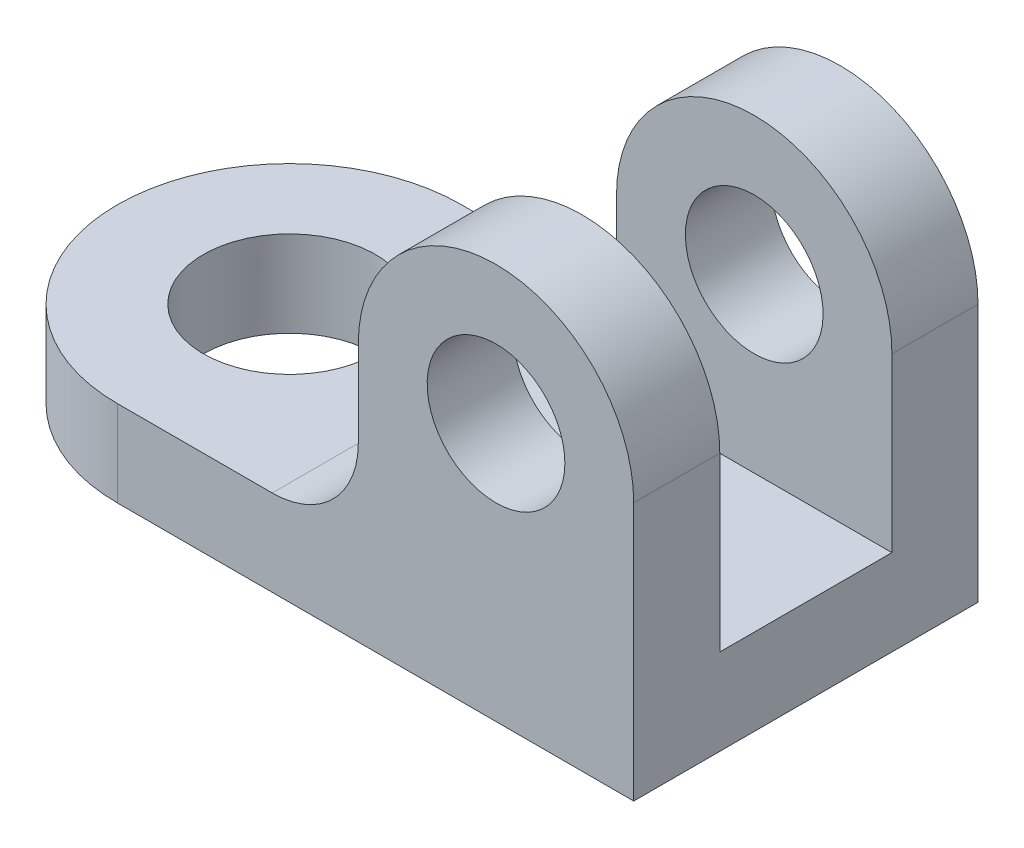
ISO-10303-21;
HEADER;
FILE_DESCRIPTION(('STEP AP214'),'2;1');
FILE_NAME('part.step','',(''),(''),'','','');
FILE_SCHEMA(('AUTOMOTIVE_DESIGN { 1 0 10303 214 1 1 1 1 }'));
ENDSEC;
DATA;
#1=APPLICATION_CONTEXT('core data for automotive mechanical design processes');
#2=APPLICATION_PROTOCOL_DEFINITION('international standard','automotive_design',2000,#1);
#3=PRODUCT_CONTEXT('',#1,'mechanical');
#4=PRODUCT('Part','Part','',(#3));
#5=PRODUCT_RELATED_PRODUCT_CATEGORY('part','',(#4));
#6=PRODUCT_DEFINITION_FORMATION('','',#4);
#7=PRODUCT_DEFINITION_CONTEXT('part definition',#1,'design');
#8=PRODUCT_DEFINITION('design','',#6,#7);
#9=PRODUCT_DEFINITION_SHAPE('','',#8);
#10=(LENGTH_UNIT() NAMED_UNIT(*) SI_UNIT(.MILLI.,.METRE.));
#11=(NAMED_UNIT(*) PLANE_ANGLE_UNIT() SI_UNIT($,.RADIAN.));
#12=(NAMED_UNIT(*) SI_UNIT($,.STERADIAN.) SOLID_ANGLE_UNIT());
#13=UNCERTAINTY_MEASURE_WITH_UNIT(LENGTH_MEASURE(1.E-05),#10,'distance_accuracy_value','');
#14=(GEOMETRIC_REPRESENTATION_CONTEXT(3) GLOBAL_UNCERTAINTY_ASSIGNED_CONTEXT((#13)) GLOBAL_UNIT_ASSIGNED_CONTEXT((#10,
#11,#12)) REPRESENTATION_CONTEXT('',''));
#15=CARTESIAN_POINT('',(0.,0.,0.));
#16=DIRECTION('',(0.,0.,1.));
#17=DIRECTION('',(1.,0.,0.));
#18=AXIS2_PLACEMENT_3D('',#15,#16,#17);
#19=CARTESIAN_POINT('',(-8.,0.,10.));
#20=DIRECTION('',(1.,0.,0.));
#21=DIRECTION('',(0.,0.,-1.));
#22=AXIS2_PLACEMENT_3D('',#19,#20,#21);
#23=PLANE('',#22);
#24=DIRECTION('',(0.,0.,-1.));
#25=VECTOR('',#24,1.);
#26=CARTESIAN_POINT('',(-8.,0.,10.));
#27=LINE('',#26,#25);
#28=CARTESIAN_POINT('',(-8.,0.,10.));
#29=VERTEX_POINT('',#28);
#30=CARTESIAN_POINT('',(-8.,0.,5.));
#31=VERTEX_POINT('',#30);
#32=EDGE_CURVE('E153',#29,#31,#27,.T.);
#33=ORIENTED_EDGE('',*,*,#32,.T.);
#34=DIRECTION('',(0.,-1.,0.));
#35=VECTOR('',#34,1.);
#36=CARTESIAN_POINT('',(-8.,0.,5.));
#37=LINE('',#36,#35);
#38=CARTESIAN_POINT('',(-8.,-5.,5.));
#39=VERTEX_POINT('',#38);
#40=EDGE_CURVE('E204',#31,#39,#37,.T.);
#41=ORIENTED_EDGE('',*,*,#40,.T.);
#42=DIRECTION('',(0.,0.,-1.));
#43=VECTOR('',#42,1.);
#44=CARTESIAN_POINT('',(-8.,-5.,10.));
#45=LINE('',#44,#43);
#46=CARTESIAN_POINT('',(-8.,-5.,10.));
#47=VERTEX_POINT('',#46);
#48=EDGE_CURVE('E267',#47,#39,#45,.T.);
#49=ORIENTED_EDGE('',*,*,#48,.F.);
#50=DIRECTION('',(0.,-1.,0.));
#51=VECTOR('',#50,1.);
#52=CARTESIAN_POINT('',(-8.,0.,10.));
#53=LINE('',#52,#51);
#54=EDGE_CURVE('E224',#29,#47,#53,.T.);
#55=ORIENTED_EDGE('',*,*,#54,.F.);
#56=EDGE_LOOP('',(#33,#41,#49,#55));
#57=FACE_BOUND('',#56,.T.);
#58=ADVANCED_FACE('F45',(#57),#23,.F.);
#59=CARTESIAN_POINT('',(0.,0.,10.));
#60=DIRECTION('',(0.,0.,-1.));
#61=DIRECTION('',(-1.,0.,0.));
#62=AXIS2_PLACEMENT_3D('',#59,#60,#61);
#63=CYLINDRICAL_SURFACE('',#62,8.);
#64=DIRECTION('',(0.,0.,-1.));
#65=VECTOR('',#64,1.);
#66=CARTESIAN_POINT('',(8.,0.,10.));
#67=LINE('',#66,#65);
#68=CARTESIAN_POINT('',(8.,0.,10.));
#69=VERTEX_POINT('',#68);
#70=CARTESIAN_POINT('',(8.,0.,5.));
#71=VERTEX_POINT('',#70);
#72=EDGE_CURVE('E254',#69,#71,#67,.T.);
#73=ORIENTED_EDGE('',*,*,#72,.T.);
#74=CARTESIAN_POINT('',(0.,0.,5.));
#75=DIRECTION('',(0.,0.,1.));
#76=DIRECTION('',(0.,-1.,0.));
#77=AXIS2_PLACEMENT_3D('',#74,#75,#76);
#78=CIRCLE('',#77,8.);
#79=EDGE_CURVE('E208',#71,#31,#78,.T.);
#80=ORIENTED_EDGE('',*,*,#79,.T.);
#81=ORIENTED_EDGE('',*,*,#32,.F.);
#82=CARTESIAN_POINT('',(0.,0.,10.));
#83=DIRECTION('',(0.,0.,1.));
#84=DIRECTION('',(-1.,0.,0.));
#85=AXIS2_PLACEMENT_3D('',#82,#83,#84);
#86=CIRCLE('',#85,8.);
#87=EDGE_CURVE('E220',#69,#29,#86,.T.);
#88=ORIENTED_EDGE('',*,*,#87,.F.);
#89=EDGE_LOOP('',(#73,#80,#81,#88));
#90=FACE_BOUND('',#89,.T.);
#91=ADVANCED_FACE('F288',(#90),#63,.T.);
#92=CARTESIAN_POINT('',(0.,0.,10.));
#93=DIRECTION('',(0.,0.,-1.));
#94=DIRECTION('',(-1.,0.,0.));
#95=AXIS2_PLACEMENT_3D('',#92,#93,#94);
#96=CYLINDRICAL_SURFACE('',#95,4.);
#97=CARTESIAN_POINT('',(0.,0.,5.));
#98=DIRECTION('',(0.,0.,1.));
#99=DIRECTION('',(0.,-1.,0.));
#100=AXIS2_PLACEMENT_3D('',#97,#98,#99);
#101=CIRCLE('',#100,4.);
#102=CARTESIAN_POINT('',(0.,-4.,5.));
#103=VERTEX_POINT('',#102);
#104=EDGE_CURVE('E199',#103,#103,#101,.T.);
#105=ORIENTED_EDGE('',*,*,#104,.F.);
#106=EDGE_LOOP('',(#105));
#107=FACE_BOUND('',#106,.T.);
#108=CARTESIAN_POINT('',(0.,0.,10.));
#109=DIRECTION('',(0.,0.,1.));
#110=DIRECTION('',(1.,0.,0.));
#111=AXIS2_PLACEMENT_3D('',#108,#109,#110);
#112=CIRCLE('',#111,4.);
#113=CARTESIAN_POINT('',(4.,0.,10.));
#114=VERTEX_POINT('',#113);
#115=EDGE_CURVE('E212',#114,#114,#112,.T.);
#116=ORIENTED_EDGE('',*,*,#115,.T.);
#117=EDGE_LOOP('',(#116));
#118=FACE_BOUND('',#117,.T.);
#119=ADVANCED_FACE('F285',(#107,#118),#96,.F.);
#120=CARTESIAN_POINT('',(0.,0.,-5.));
#121=DIRECTION('',(0.,0.,-1.));
#122=DIRECTION('',(0.,1.,0.));
#123=AXIS2_PLACEMENT_3D('',#120,#121,#122);
#124=CIRCLE('',#123,8.);
#125=CARTESIAN_POINT('',(-8.,0.,-5.));
#126=VERTEX_POINT('',#125);
#127=CARTESIAN_POINT('',(8.,0.,-5.));
#128=VERTEX_POINT('',#127);
#129=EDGE_CURVE('E196',#126,#128,#124,.T.);
#130=ORIENTED_EDGE('',*,*,#129,.T.);
#131=CARTESIAN_POINT('',(8.,0.,-10.));
#132=VERTEX_POINT('',#131);
#133=EDGE_CURVE('E239',#128,#132,#67,.T.);
#134=ORIENTED_EDGE('',*,*,#133,.T.);
#135=CARTESIAN_POINT('',(0.,0.,-10.));
#136=DIRECTION('',(0.,0.,1.));
#137=DIRECTION('',(-1.,0.,0.));
#138=AXIS2_PLACEMENT_3D('',#135,#136,#137);
#139=CIRCLE('',#138,8.);
#140=CARTESIAN_POINT('',(-8.,0.,-10.));
#141=VERTEX_POINT('',#140);
#142=EDGE_CURVE('E216',#132,#141,#139,.T.);
#143=ORIENTED_EDGE('',*,*,#142,.T.);
#144=EDGE_CURVE('E271',#126,#141,#27,.T.);
#145=ORIENTED_EDGE('',*,*,#144,.F.);
#146=EDGE_LOOP('',(#130,#134,#143,#145));
#147=FACE_BOUND('',#146,.T.);
#148=ADVANCED_FACE('F47',(#147),#63,.T.);
#149=CARTESIAN_POINT('',(-8.,-5.,-5.));
#150=VERTEX_POINT('',#149);
#151=CARTESIAN_POINT('',(-8.,-5.,-10.));
#152=VERTEX_POINT('',#151);
#153=EDGE_CURVE('E266',#150,#152,#45,.T.);
#154=ORIENTED_EDGE('',*,*,#153,.F.);
#155=DIRECTION('',(0.,1.,0.));
#156=VECTOR('',#155,1.);
#157=CARTESIAN_POINT('',(-8.,0.,-5.));
#158=LINE('',#157,#156);
#159=EDGE_CURVE('E192',#150,#126,#158,.T.);
#160=ORIENTED_EDGE('',*,*,#159,.T.);
#161=ORIENTED_EDGE('',*,*,#144,.T.);
#162=DIRECTION('',(0.,-1.,0.));
#163=VECTOR('',#162,1.);
#164=CARTESIAN_POINT('',(-8.,0.,-10.));
#165=LINE('',#164,#163);
#166=EDGE_CURVE('E243',#141,#152,#165,.T.);
#167=ORIENTED_EDGE('',*,*,#166,.T.);
#168=EDGE_LOOP('',(#154,#160,#161,#167));
#169=FACE_BOUND('',#168,.T.);
#170=ADVANCED_FACE('F332',(#169),#23,.F.);
#171=CARTESIAN_POINT('',(0.,0.,-5.));
#172=DIRECTION('',(0.,0.,-1.));
#173=DIRECTION('',(0.,1.,0.));
#174=AXIS2_PLACEMENT_3D('',#171,#172,#173);
#175=CIRCLE('',#174,4.);
#176=CARTESIAN_POINT('',(0.,4.,-5.));
#177=VERTEX_POINT('',#176);
#178=EDGE_CURVE('E184',#177,#177,#175,.T.);
#179=ORIENTED_EDGE('',*,*,#178,.F.);
#180=EDGE_LOOP('',(#179));
#181=FACE_BOUND('',#180,.T.);
#182=CARTESIAN_POINT('',(0.,0.,-10.));
#183=DIRECTION('',(0.,0.,1.));
#184=DIRECTION('',(1.,0.,0.));
#185=AXIS2_PLACEMENT_3D('',#182,#183,#184);
#186=CIRCLE('',#185,4.);
#187=CARTESIAN_POINT('',(4.,0.,-10.));
#188=VERTEX_POINT('',#187);
#189=EDGE_CURVE('E211',#188,#188,#186,.T.);
#190=ORIENTED_EDGE('',*,*,#189,.F.);
#191=EDGE_LOOP('',(#190));
#192=FACE_BOUND('',#191,.T.);
#193=ADVANCED_FACE('F290',(#181,#192),#96,.F.);
#194=CARTESIAN_POINT('',(-13.,-5.,10.));
#195=DIRECTION('',(0.,0.,-1.));
#196=DIRECTION('',(-1.,0.,0.));
#197=AXIS2_PLACEMENT_3D('',#194,#195,#196);
#198=CYLINDRICAL_SURFACE('',#197,5.);
#199=DIRECTION('',(0.,0.,-1.));
#200=VECTOR('',#199,1.);
#201=CARTESIAN_POINT('',(-13.,-10.,10.));
#202=LINE('',#201,#200);
#203=CARTESIAN_POINT('',(-13.,-10.,-5.));
#204=VERTEX_POINT('',#203);
#205=CARTESIAN_POINT('',(-13.,-10.,-10.));
#206=VERTEX_POINT('',#205);
#207=EDGE_CURVE('E142',#204,#206,#202,.T.);
#208=ORIENTED_EDGE('',*,*,#207,.F.);
#209=CARTESIAN_POINT('',(-13.,-5.,-5.));
#210=DIRECTION('',(0.,0.,-1.));
#211=DIRECTION('',(0.,1.,0.));
#212=AXIS2_PLACEMENT_3D('',#209,#210,#211);
#213=CIRCLE('',#212,5.);
#214=EDGE_CURVE('E188',#204,#150,#213,.F.);
#215=ORIENTED_EDGE('',*,*,#214,.T.);
#216=ORIENTED_EDGE('',*,*,#153,.T.);
#217=CARTESIAN_POINT('',(-13.,-5.,-10.));
#218=DIRECTION('',(0.,0.,-1.));
#219=DIRECTION('',(1.,0.,0.));
#220=AXIS2_PLACEMENT_3D('',#217,#218,#219);
#221=CIRCLE('',#220,5.);
#222=EDGE_CURVE('E146',#152,#206,#221,.T.);
#223=ORIENTED_EDGE('',*,*,#222,.T.);
#224=EDGE_LOOP('',(#208,#215,#216,#223));
#225=FACE_BOUND('',#224,.T.);
#226=ADVANCED_FACE('F322',(#225),#198,.F.);
#227=CARTESIAN_POINT('',(-32.,7.99999999999999,-5.));
#228=DIRECTION('',(0.,0.,-1.));
#229=DIRECTION('',(0.,1.,0.));
#230=AXIS2_PLACEMENT_3D('',#227,#228,#229);
#231=PLANE('',#230);
#232=ORIENTED_EDGE('',*,*,#178,.T.);
#233=EDGE_LOOP('',(#232));
#234=FACE_BOUND('',#233,.T.);
#235=ORIENTED_EDGE('',*,*,#129,.F.);
#236=ORIENTED_EDGE('',*,*,#159,.F.);
#237=ORIENTED_EDGE('',*,*,#214,.F.);
#238=DIRECTION('',(1.,0.,0.));
#239=VECTOR('',#238,1.);
#240=CARTESIAN_POINT('',(-32.,-10.,-5.));
#241=LINE('',#240,#239);
#242=CARTESIAN_POINT('',(8.,-10.,-5.));
#243=VERTEX_POINT('',#242);
#244=EDGE_CURVE('E181',#204,#243,#241,.T.);
#245=ORIENTED_EDGE('',*,*,#244,.T.);
#246=DIRECTION('',(0.,1.,0.));
#247=VECTOR('',#246,1.);
#248=CARTESIAN_POINT('',(8.,8.,-5.));
#249=LINE('',#248,#247);
#250=EDGE_CURVE('E176',#243,#128,#249,.T.);
#251=ORIENTED_EDGE('',*,*,#250,.T.);
#252=EDGE_LOOP('',(#235,#236,#237,#245,#251));
#253=FACE_BOUND('',#252,.T.);
#254=ADVANCED_FACE('F320',(#234,#253),#231,.F.);
#255=CARTESIAN_POINT('',(-32.,7.99999999999999,5.));
#256=DIRECTION('',(0.,0.,1.));
#257=DIRECTION('',(0.,-1.,0.));
#258=AXIS2_PLACEMENT_3D('',#255,#256,#257);
#259=PLANE('',#258);
#260=ORIENTED_EDGE('',*,*,#104,.T.);
#261=EDGE_LOOP('',(#260));
#262=FACE_BOUND('',#261,.T.);
#263=DIRECTION('',(0.,-1.,0.));
#264=VECTOR('',#263,1.);
#265=CARTESIAN_POINT('',(8.,8.,5.));
#266=LINE('',#265,#264);
#267=CARTESIAN_POINT('',(8.,-10.,5.));
#268=VERTEX_POINT('',#267);
#269=EDGE_CURVE('E156',#71,#268,#266,.T.);
#270=ORIENTED_EDGE('',*,*,#269,.T.);
#271=DIRECTION('',(1.,0.,0.));
#272=VECTOR('',#271,1.);
#273=CARTESIAN_POINT('',(-32.,-10.,5.));
#274=LINE('',#273,#272);
#275=CARTESIAN_POINT('',(-13.,-10.,5.));
#276=VERTEX_POINT('',#275);
#277=EDGE_CURVE('E180',#276,#268,#274,.T.);
#278=ORIENTED_EDGE('',*,*,#277,.F.);
#279=CARTESIAN_POINT('',(-13.,-5.,5.));
#280=DIRECTION('',(0.,0.,1.));
#281=DIRECTION('',(0.,-1.,0.));
#282=AXIS2_PLACEMENT_3D('',#279,#280,#281);
#283=CIRCLE('',#282,5.);
#284=EDGE_CURVE('E200',#39,#276,#283,.F.);
#285=ORIENTED_EDGE('',*,*,#284,.F.);
#286=ORIENTED_EDGE('',*,*,#40,.F.);
#287=ORIENTED_EDGE('',*,*,#79,.F.);
#288=EDGE_LOOP('',(#270,#278,#285,#286,#287));
#289=FACE_BOUND('',#288,.T.);
#290=ADVANCED_FACE('F282',(#262,#289),#259,.F.);
#291=ORIENTED_EDGE('',*,*,#48,.T.);
#292=ORIENTED_EDGE('',*,*,#284,.T.);
#293=CARTESIAN_POINT('',(-13.,-10.,10.));
#294=VERTEX_POINT('',#293);
#295=EDGE_CURVE('E262',#294,#276,#202,.T.);
#296=ORIENTED_EDGE('',*,*,#295,.F.);
#297=CARTESIAN_POINT('',(-13.,-5.,10.));
#298=DIRECTION('',(0.,0.,-1.));
#299=DIRECTION('',(1.,0.,0.));
#300=AXIS2_PLACEMENT_3D('',#297,#298,#299);
#301=CIRCLE('',#300,5.);
#302=EDGE_CURVE('E228',#47,#294,#301,.T.);
#303=ORIENTED_EDGE('',*,*,#302,.F.);
#304=EDGE_LOOP('',(#291,#292,#296,#303));
#305=FACE_BOUND('',#304,.T.);
#306=ADVANCED_FACE('F296',(#305),#198,.F.);
#307=CARTESIAN_POINT('',(0.,0.,10.));
#308=DIRECTION('',(0.,0.,-1.));
#309=DIRECTION('',(-1.,0.,0.));
#310=AXIS2_PLACEMENT_3D('',#307,#308,#309);
#311=PLANE('',#310);
#312=ORIENTED_EDGE('',*,*,#115,.F.);
#313=EDGE_LOOP('',(#312));
#314=FACE_BOUND('',#313,.T.);
#315=DIRECTION('',(0.,-1.,0.));
#316=VECTOR('',#315,1.);
#317=CARTESIAN_POINT('',(-22.,0.,10.));
#318=LINE('',#317,#316);
#319=CARTESIAN_POINT('',(-22.,-15.,10.));
#320=VERTEX_POINT('',#319);
#321=CARTESIAN_POINT('',(-22.,-10.,10.));
#322=VERTEX_POINT('',#321);
#323=EDGE_CURVE('E11',#320,#322,#318,.F.);
#324=ORIENTED_EDGE('',*,*,#323,.F.);
#325=DIRECTION('',(1.,0.,0.));
#326=VECTOR('',#325,1.);
#327=CARTESIAN_POINT('',(8.,-15.,10.));
#328=LINE('',#327,#326);
#329=CARTESIAN_POINT('',(8.,-15.,10.));
#330=VERTEX_POINT('',#329);
#331=EDGE_CURVE('E233',#320,#330,#328,.T.);
#332=ORIENTED_EDGE('',*,*,#331,.T.);
#333=DIRECTION('',(0.,1.,0.));
#334=VECTOR('',#333,1.);
#335=CARTESIAN_POINT('',(8.,0.,10.));
#336=LINE('',#335,#334);
#337=EDGE_CURVE('E236',#330,#69,#336,.T.);
#338=ORIENTED_EDGE('',*,*,#337,.T.);
#339=ORIENTED_EDGE('',*,*,#87,.T.);
#340=ORIENTED_EDGE('',*,*,#54,.T.);
#341=ORIENTED_EDGE('',*,*,#302,.T.);
#342=DIRECTION('',(-1.,0.,0.));
#343=VECTOR('',#342,1.);
#344=CARTESIAN_POINT('',(-32.,-10.,10.));
#345=LINE('',#344,#343);
#346=EDGE_CURVE('E69',#294,#322,#345,.T.);
#347=ORIENTED_EDGE('',*,*,#346,.T.);
#348=EDGE_LOOP('',(#324,#332,#338,#339,#340,#341,#347));
#349=FACE_BOUND('',#348,.T.);
#350=ADVANCED_FACE('F293',(#314,#349),#311,.F.);
#351=CARTESIAN_POINT('',(8.,0.,10.));
#352=DIRECTION('',(-1.,0.,0.));
#353=DIRECTION('',(0.,-1.,0.));
#354=AXIS2_PLACEMENT_3D('',#351,#352,#353);
#355=PLANE('',#354);
#356=DIRECTION('',(0.,0.,-1.));
#357=VECTOR('',#356,1.);
#358=CARTESIAN_POINT('',(8.,-10.,5.));
#359=LINE('',#358,#357);
#360=EDGE_CURVE('E161',#268,#243,#359,.T.);
#361=ORIENTED_EDGE('',*,*,#360,.F.);
#362=ORIENTED_EDGE('',*,*,#269,.F.);
#363=ORIENTED_EDGE('',*,*,#72,.F.);
#364=ORIENTED_EDGE('',*,*,#337,.F.);
#365=DIRECTION('',(0.,0.,-1.));
#366=VECTOR('',#365,1.);
#367=CARTESIAN_POINT('',(8.,-15.,10.));
#368=LINE('',#367,#366);
#369=CARTESIAN_POINT('',(8.,-15.,-10.));
#370=VERTEX_POINT('',#369);
#371=EDGE_CURVE('E258',#330,#370,#368,.T.);
#372=ORIENTED_EDGE('',*,*,#371,.T.);
#373=DIRECTION('',(0.,1.,0.));
#374=VECTOR('',#373,1.);
#375=CARTESIAN_POINT('',(8.,0.,-10.));
#376=LINE('',#375,#374);
#377=EDGE_CURVE('E225',#370,#132,#376,.T.);
#378=ORIENTED_EDGE('',*,*,#377,.T.);
#379=ORIENTED_EDGE('',*,*,#133,.F.);
#380=ORIENTED_EDGE('',*,*,#250,.F.);
#381=EDGE_LOOP('',(#361,#362,#363,#364,#372,#378,#379,#380));
#382=FACE_BOUND('',#381,.T.);
#383=ADVANCED_FACE('F295',(#382),#355,.F.);
#384=CARTESIAN_POINT('',(0.,0.,-10.));
#385=DIRECTION('',(0.,0.,-1.));
#386=DIRECTION('',(-1.,0.,0.));
#387=AXIS2_PLACEMENT_3D('',#384,#385,#386);
#388=PLANE('',#387);
#389=ORIENTED_EDGE('',*,*,#189,.T.);
#390=EDGE_LOOP('',(#389));
#391=FACE_BOUND('',#390,.T.);
#392=DIRECTION('',(1.,0.,0.));
#393=VECTOR('',#392,1.);
#394=CARTESIAN_POINT('',(8.,-15.,-10.));
#395=LINE('',#394,#393);
#396=CARTESIAN_POINT('',(-22.,-15.,-10.));
#397=VERTEX_POINT('',#396);
#398=EDGE_CURVE('E61',#397,#370,#395,.T.);
#399=ORIENTED_EDGE('',*,*,#398,.F.);
#400=DIRECTION('',(0.,-1.,0.));
#401=VECTOR('',#400,1.);
#402=CARTESIAN_POINT('',(-22.,0.,-10.));
#403=LINE('',#402,#401);
#404=CARTESIAN_POINT('',(-22.,-10.,-10.));
#405=VERTEX_POINT('',#404);
#406=EDGE_CURVE('E54',#397,#405,#403,.F.);
#407=ORIENTED_EDGE('',*,*,#406,.T.);
#408=DIRECTION('',(-1.,0.,0.));
#409=VECTOR('',#408,1.);
#410=CARTESIAN_POINT('',(-32.,-10.,-10.));
#411=LINE('',#410,#409);
#412=EDGE_CURVE('E135',#206,#405,#411,.T.);
#413=ORIENTED_EDGE('',*,*,#412,.F.);
#414=ORIENTED_EDGE('',*,*,#222,.F.);
#415=ORIENTED_EDGE('',*,*,#166,.F.);
#416=ORIENTED_EDGE('',*,*,#142,.F.);
#417=ORIENTED_EDGE('',*,*,#377,.F.);
#418=EDGE_LOOP('',(#399,#407,#413,#414,#415,#416,#417));
#419=FACE_BOUND('',#418,.T.);
#420=ADVANCED_FACE('F148',(#391,#419),#388,.T.);
#421=CARTESIAN_POINT('',(8.,-15.,10.));
#422=DIRECTION('',(0.,1.,0.));
#423=DIRECTION('',(-1.,0.,0.));
#424=AXIS2_PLACEMENT_3D('',#421,#422,#423);
#425=PLANE('',#424);
#426=ORIENTED_EDGE('',*,*,#331,.F.);
#427=CARTESIAN_POINT('',(-22.,-15.,0.));
#428=DIRECTION('',(0.,1.,0.));
#429=DIRECTION('',(-1.,0.,0.));
#430=AXIS2_PLACEMENT_3D('',#427,#428,#429);
#431=CIRCLE('',#430,10.);
#432=EDGE_CURVE('E164',#320,#397,#431,.F.);
#433=ORIENTED_EDGE('',*,*,#432,.T.);
#434=ORIENTED_EDGE('',*,*,#398,.T.);
#435=ORIENTED_EDGE('',*,*,#371,.F.);
#436=EDGE_LOOP('',(#426,#433,#434,#435));
#437=FACE_BOUND('',#436,.T.);
#438=CARTESIAN_POINT('',(-22.,-15.,0.));
#439=DIRECTION('',(0.,1.,0.));
#440=DIRECTION('',(-1.,0.,0.));
#441=AXIS2_PLACEMENT_3D('',#438,#439,#440);
#442=CIRCLE('',#441,5.);
#443=CARTESIAN_POINT('',(-27.,-15.,0.));
#444=VERTEX_POINT('',#443);
#445=EDGE_CURVE('E168',#444,#444,#442,.F.);
#446=ORIENTED_EDGE('',*,*,#445,.F.);
#447=EDGE_LOOP('',(#446));
#448=FACE_BOUND('',#447,.T.);
#449=ADVANCED_FACE('F301',(#437,#448),#425,.F.);
#450=CARTESIAN_POINT('',(-32.,-10.,10.));
#451=DIRECTION('',(0.,-1.,0.));
#452=DIRECTION('',(1.,0.,0.));
#453=AXIS2_PLACEMENT_3D('',#450,#451,#452);
#454=PLANE('',#453);
#455=ORIENTED_EDGE('',*,*,#412,.T.);
#456=CARTESIAN_POINT('',(-22.,-10.,0.));
#457=DIRECTION('',(0.,-1.,0.));
#458=DIRECTION('',(1.,0.,0.));
#459=AXIS2_PLACEMENT_3D('',#456,#457,#458);
#460=CIRCLE('',#459,10.);
#461=EDGE_CURVE('E139',#405,#322,#460,.F.);
#462=ORIENTED_EDGE('',*,*,#461,.T.);
#463=ORIENTED_EDGE('',*,*,#346,.F.);
#464=ORIENTED_EDGE('',*,*,#295,.T.);
#465=ORIENTED_EDGE('',*,*,#277,.T.);
#466=ORIENTED_EDGE('',*,*,#360,.T.);
#467=ORIENTED_EDGE('',*,*,#244,.F.);
#468=ORIENTED_EDGE('',*,*,#207,.T.);
#469=EDGE_LOOP('',(#455,#462,#463,#464,#465,#466,#467,#468));
#470=FACE_BOUND('',#469,.T.);
#471=CARTESIAN_POINT('',(-22.,-10.,0.));
#472=DIRECTION('',(0.,-1.,0.));
#473=DIRECTION('',(1.,0.,0.));
#474=AXIS2_PLACEMENT_3D('',#471,#472,#473);
#475=CIRCLE('',#474,5.);
#476=CARTESIAN_POINT('',(-17.,-10.,0.));
#477=VERTEX_POINT('',#476);
#478=EDGE_CURVE('E157',#477,#477,#475,.F.);
#479=ORIENTED_EDGE('',*,*,#478,.F.);
#480=EDGE_LOOP('',(#479));
#481=FACE_BOUND('',#480,.T.);
#482=ADVANCED_FACE('F136',(#470,#481),#454,.F.);
#483=CARTESIAN_POINT('',(-22.,0.,0.));
#484=DIRECTION('',(0.,-1.,0.));
#485=DIRECTION('',(1.,0.,0.));
#486=AXIS2_PLACEMENT_3D('',#483,#484,#485);
#487=CYLINDRICAL_SURFACE('',#486,10.);
#488=ORIENTED_EDGE('',*,*,#432,.F.);
#489=ORIENTED_EDGE('',*,*,#323,.T.);
#490=ORIENTED_EDGE('',*,*,#461,.F.);
#491=ORIENTED_EDGE('',*,*,#406,.F.);
#492=EDGE_LOOP('',(#488,#489,#490,#491));
#493=FACE_BOUND('',#492,.T.);
#494=ADVANCED_FACE('F154',(#493),#487,.T.);
#495=CARTESIAN_POINT('',(-22.,0.,0.));
#496=DIRECTION('',(0.,-1.,0.));
#497=DIRECTION('',(1.,0.,0.));
#498=AXIS2_PLACEMENT_3D('',#495,#496,#497);
#499=CYLINDRICAL_SURFACE('',#498,5.);
#500=ORIENTED_EDGE('',*,*,#445,.T.);
#501=EDGE_LOOP('',(#500));
#502=FACE_BOUND('',#501,.T.);
#503=ORIENTED_EDGE('',*,*,#478,.T.);
#504=EDGE_LOOP('',(#503));
#505=FACE_BOUND('',#504,.T.);
#506=ADVANCED_FACE('F412',(#502,#505),#499,.F.);
#507=CLOSED_SHELL('',(#58,#91,#119,#148,#170,#193,#226,#254,#290,#306,#350,#383,#420,#449,#482,
#494,#506));
#508=MANIFOLD_SOLID_BREP('B2',#507);
#509=ADVANCED_BREP_SHAPE_REPRESENTATION('',(#18,#508),#14);
#510=SHAPE_DEFINITION_REPRESENTATION(#9,#509);
ENDSEC;
END-ISO-10303-21;
